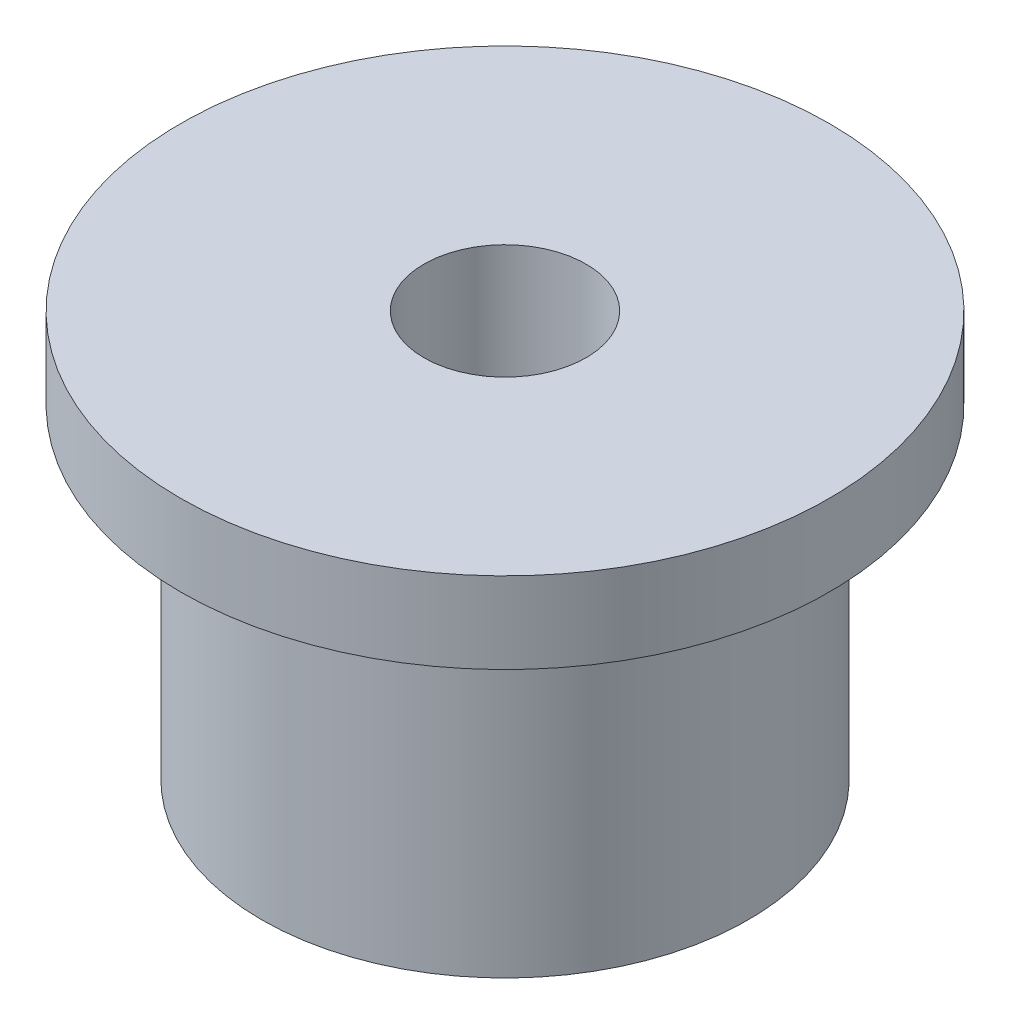
ISO-10303-21;
HEADER;
FILE_DESCRIPTION(('STEP AP214'),'2;1');
FILE_NAME('part.step','',(''),(''),'','','');
FILE_SCHEMA(('AUTOMOTIVE_DESIGN { 1 0 10303 214 1 1 1 1 }'));
ENDSEC;
DATA;
#1=APPLICATION_CONTEXT('core data for automotive mechanical design processes');
#2=APPLICATION_PROTOCOL_DEFINITION('international standard','automotive_design',2000,#1);
#3=PRODUCT_CONTEXT('',#1,'mechanical');
#4=PRODUCT('Part','Part','',(#3));
#5=PRODUCT_RELATED_PRODUCT_CATEGORY('part','',(#4));
#6=PRODUCT_DEFINITION_FORMATION('','',#4);
#7=PRODUCT_DEFINITION_CONTEXT('part definition',#1,'design');
#8=PRODUCT_DEFINITION('design','',#6,#7);
#9=PRODUCT_DEFINITION_SHAPE('','',#8);
#10=(LENGTH_UNIT() NAMED_UNIT(*) SI_UNIT(.MILLI.,.METRE.));
#11=(NAMED_UNIT(*) PLANE_ANGLE_UNIT() SI_UNIT($,.RADIAN.));
#12=(NAMED_UNIT(*) SI_UNIT($,.STERADIAN.) SOLID_ANGLE_UNIT());
#13=UNCERTAINTY_MEASURE_WITH_UNIT(LENGTH_MEASURE(1.E-05),#10,'distance_accuracy_value','');
#14=(GEOMETRIC_REPRESENTATION_CONTEXT(3) GLOBAL_UNCERTAINTY_ASSIGNED_CONTEXT((#13)) GLOBAL_UNIT_ASSIGNED_CONTEXT((#10,
#11,#12)) REPRESENTATION_CONTEXT('',''));
#15=CARTESIAN_POINT('',(0.,0.,0.));
#16=DIRECTION('',(0.,0.,1.));
#17=DIRECTION('',(1.,0.,0.));
#18=AXIS2_PLACEMENT_3D('',#15,#16,#17);
#19=CARTESIAN_POINT('',(0.83858242071061,0.,0.));
#20=DIRECTION('',(0.,1.,0.));
#21=DIRECTION('',(0.,0.,1.));
#22=AXIS2_PLACEMENT_3D('',#19,#20,#21);
#23=PLANE('',#22);
#24=CARTESIAN_POINT('',(0.83858242071061,0.,0.));
#25=DIRECTION('',(0.,1.,0.));
#26=DIRECTION('',(0.,0.,1.));
#27=AXIS2_PLACEMENT_3D('',#24,#25,#26);
#28=CIRCLE('',#27,19.05);
#29=CARTESIAN_POINT('',(0.838582420710624,0.,19.05));
#30=VERTEX_POINT('',#29);
#31=EDGE_CURVE('E48',#30,#30,#28,.T.);
#32=ORIENTED_EDGE('',*,*,#31,.F.);
#33=EDGE_LOOP('',(#32));
#34=FACE_BOUND('',#33,.T.);
#35=CARTESIAN_POINT('',(0.83858242071061,0.,0.));
#36=DIRECTION('',(0.,1.,0.));
#37=DIRECTION('',(0.,0.,1.));
#38=AXIS2_PLACEMENT_3D('',#35,#36,#37);
#39=CIRCLE('',#38,6.35);
#40=CARTESIAN_POINT('',(0.838582420710615,0.,6.35));
#41=VERTEX_POINT('',#40);
#42=EDGE_CURVE('E55',#41,#41,#39,.T.);
#43=ORIENTED_EDGE('',*,*,#42,.T.);
#44=EDGE_LOOP('',(#43));
#45=FACE_BOUND('',#44,.T.);
#46=ADVANCED_FACE('F44',(#34,#45),#23,.F.);
#47=CARTESIAN_POINT('',(0.838582420710443,25.4,2.22044604925031E-13));
#48=DIRECTION('',(0.,-1.,0.));
#49=DIRECTION('',(0.,0.,-1.));
#50=AXIS2_PLACEMENT_3D('',#47,#48,#49);
#51=CYLINDRICAL_SURFACE('',#50,19.05);
#52=CARTESIAN_POINT('',(0.838582420710443,25.4,2.22044604925031E-13));
#53=DIRECTION('',(0.,1.,0.));
#54=DIRECTION('',(0.,0.,1.));
#55=AXIS2_PLACEMENT_3D('',#52,#53,#54);
#56=CIRCLE('',#55,19.05);
#57=CARTESIAN_POINT('',(0.838582420710458,25.4,19.0500000000002));
#58=VERTEX_POINT('',#57);
#59=EDGE_CURVE('E12',#58,#58,#56,.T.);
#60=ORIENTED_EDGE('',*,*,#59,.F.);
#61=EDGE_LOOP('',(#60));
#62=FACE_BOUND('',#61,.T.);
#63=ORIENTED_EDGE('',*,*,#31,.T.);
#64=EDGE_LOOP('',(#63));
#65=FACE_BOUND('',#64,.T.);
#66=ADVANCED_FACE('F46',(#62,#65),#51,.T.);
#67=CARTESIAN_POINT('',(0.838582420710443,25.4,2.22044604925031E-13));
#68=DIRECTION('',(0.,-1.,0.));
#69=DIRECTION('',(0.,0.,-1.));
#70=AXIS2_PLACEMENT_3D('',#67,#68,#69);
#71=CYLINDRICAL_SURFACE('',#70,6.35);
#72=ORIENTED_EDGE('',*,*,#42,.F.);
#73=EDGE_LOOP('',(#72));
#74=FACE_BOUND('',#73,.T.);
#75=CARTESIAN_POINT('',(0.838582420710443,31.75,2.22044604925031E-13));
#76=DIRECTION('',(0.,1.,0.));
#77=DIRECTION('',(0.,0.,1.));
#78=AXIS2_PLACEMENT_3D('',#75,#76,#77);
#79=CIRCLE('',#78,6.35);
#80=CARTESIAN_POINT('',(0.838582420710448,31.75,6.35000000000022));
#81=VERTEX_POINT('',#80);
#82=EDGE_CURVE('E63',#81,#81,#79,.T.);
#83=ORIENTED_EDGE('',*,*,#82,.T.);
#84=EDGE_LOOP('',(#83));
#85=FACE_BOUND('',#84,.T.);
#86=ADVANCED_FACE('F69',(#74,#85),#71,.F.);
#87=CARTESIAN_POINT('',(0.838582420710443,31.75,2.22044604925031E-13));
#88=DIRECTION('',(0.,1.,0.));
#89=DIRECTION('',(0.,0.,1.));
#90=AXIS2_PLACEMENT_3D('',#87,#88,#89);
#91=PLANE('',#90);
#92=CARTESIAN_POINT('',(0.838582420710443,31.75,2.22044604925031E-13));
#93=DIRECTION('',(0.,1.,0.));
#94=DIRECTION('',(0.,0.,1.));
#95=AXIS2_PLACEMENT_3D('',#92,#93,#94);
#96=CIRCLE('',#95,25.4);
#97=CARTESIAN_POINT('',(0.838582420710463,31.75,25.4000000000002));
#98=VERTEX_POINT('',#97);
#99=EDGE_CURVE('E59',#98,#98,#96,.T.);
#100=ORIENTED_EDGE('',*,*,#99,.T.);
#101=EDGE_LOOP('',(#100));
#102=FACE_BOUND('',#101,.T.);
#103=ORIENTED_EDGE('',*,*,#82,.F.);
#104=EDGE_LOOP('',(#103));
#105=FACE_BOUND('',#104,.T.);
#106=ADVANCED_FACE('F71',(#102,#105),#91,.T.);
#107=CARTESIAN_POINT('',(0.838582420710443,25.4,2.22044604925031E-13));
#108=DIRECTION('',(0.,1.,0.));
#109=DIRECTION('',(0.,0.,1.));
#110=AXIS2_PLACEMENT_3D('',#107,#108,#109);
#111=PLANE('',#110);
#112=ORIENTED_EDGE('',*,*,#59,.T.);
#113=EDGE_LOOP('',(#112));
#114=FACE_BOUND('',#113,.T.);
#115=CARTESIAN_POINT('',(0.838582420710443,25.4,2.22044604925031E-13));
#116=DIRECTION('',(0.,1.,0.));
#117=DIRECTION('',(0.,0.,1.));
#118=AXIS2_PLACEMENT_3D('',#115,#116,#117);
#119=CIRCLE('',#118,25.4);
#120=CARTESIAN_POINT('',(0.838582420710463,25.4,25.4000000000002));
#121=VERTEX_POINT('',#120);
#122=EDGE_CURVE('E60',#121,#121,#119,.T.);
#123=ORIENTED_EDGE('',*,*,#122,.F.);
#124=EDGE_LOOP('',(#123));
#125=FACE_BOUND('',#124,.T.);
#126=ADVANCED_FACE('F73',(#114,#125),#111,.F.);
#127=CARTESIAN_POINT('',(0.838582420710443,31.75,2.22044604925031E-13));
#128=DIRECTION('',(0.,-1.,0.));
#129=DIRECTION('',(0.,0.,-1.));
#130=AXIS2_PLACEMENT_3D('',#127,#128,#129);
#131=CYLINDRICAL_SURFACE('',#130,25.4);
#132=ORIENTED_EDGE('',*,*,#99,.F.);
#133=EDGE_LOOP('',(#132));
#134=FACE_BOUND('',#133,.T.);
#135=ORIENTED_EDGE('',*,*,#122,.T.);
#136=EDGE_LOOP('',(#135));
#137=FACE_BOUND('',#136,.T.);
#138=ADVANCED_FACE('F80',(#134,#137),#131,.T.);
#139=CLOSED_SHELL('',(#46,#66,#86,#106,#126,#138));
#140=MANIFOLD_SOLID_BREP('B2',#139);
#141=ADVANCED_BREP_SHAPE_REPRESENTATION('',(#18,#140),#14);
#142=SHAPE_DEFINITION_REPRESENTATION(#9,#141);
ENDSEC;
END-ISO-10303-21;
